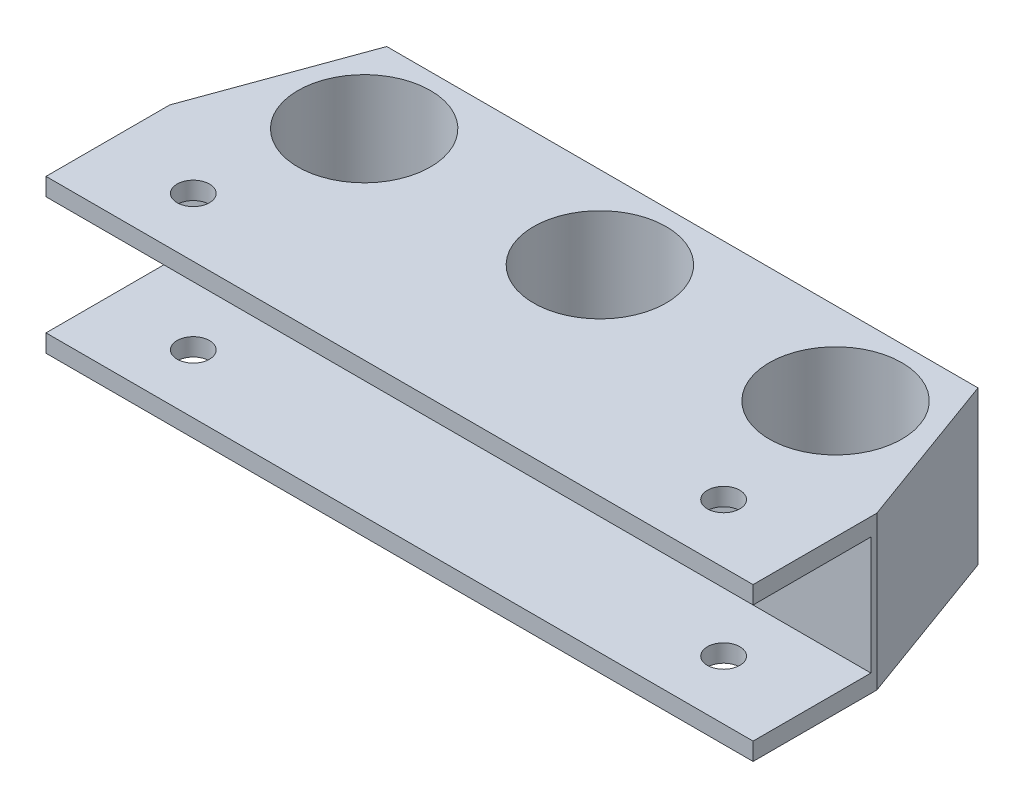
ISO-10303-21;
HEADER;
FILE_DESCRIPTION(('STEP AP214'),'2;1');
FILE_NAME('part.step','',(''),(''),'','','');
FILE_SCHEMA(('AUTOMOTIVE_DESIGN { 1 0 10303 214 1 1 1 1 }'));
ENDSEC;
DATA;
#1=APPLICATION_CONTEXT('core data for automotive mechanical design processes');
#2=APPLICATION_PROTOCOL_DEFINITION('international standard','automotive_design',2000,#1);
#3=PRODUCT_CONTEXT('',#1,'mechanical');
#4=PRODUCT('Part','Part','',(#3));
#5=PRODUCT_RELATED_PRODUCT_CATEGORY('part','',(#4));
#6=PRODUCT_DEFINITION_FORMATION('','',#4);
#7=PRODUCT_DEFINITION_CONTEXT('part definition',#1,'design');
#8=PRODUCT_DEFINITION('design','',#6,#7);
#9=PRODUCT_DEFINITION_SHAPE('','',#8);
#10=(LENGTH_UNIT() NAMED_UNIT(*) SI_UNIT(.MILLI.,.METRE.));
#11=(NAMED_UNIT(*) PLANE_ANGLE_UNIT() SI_UNIT($,.RADIAN.));
#12=(NAMED_UNIT(*) SI_UNIT($,.STERADIAN.) SOLID_ANGLE_UNIT());
#13=UNCERTAINTY_MEASURE_WITH_UNIT(LENGTH_MEASURE(1.E-05),#10,'distance_accuracy_value','');
#14=(GEOMETRIC_REPRESENTATION_CONTEXT(3) GLOBAL_UNCERTAINTY_ASSIGNED_CONTEXT((#13)) GLOBAL_UNIT_ASSIGNED_CONTEXT((#10,
#11,#12)) REPRESENTATION_CONTEXT('',''));
#15=CARTESIAN_POINT('',(0.,0.,0.));
#16=DIRECTION('',(0.,0.,1.));
#17=DIRECTION('',(1.,0.,0.));
#18=AXIS2_PLACEMENT_3D('',#15,#16,#17);
#19=CARTESIAN_POINT('',(-60.,13.,10.5));
#20=DIRECTION('',(0.,0.,-1.));
#21=DIRECTION('',(-1.,0.,0.));
#22=AXIS2_PLACEMENT_3D('',#19,#20,#21);
#23=PLANE('',#22);
#24=DIRECTION('',(0.,-1.,0.));
#25=VECTOR('',#24,1.);
#26=CARTESIAN_POINT('',(60.,13.,10.5));
#27=LINE('',#26,#25);
#28=CARTESIAN_POINT('',(60.,-9.99999999999999,10.5));
#29=VERTEX_POINT('',#28);
#30=CARTESIAN_POINT('',(60.,-13.,10.5));
#31=VERTEX_POINT('',#30);
#32=EDGE_CURVE('E162',#29,#31,#27,.T.);
#33=ORIENTED_EDGE('',*,*,#32,.F.);
#34=DIRECTION('',(-1.,0.,0.));
#35=VECTOR('',#34,1.);
#36=CARTESIAN_POINT('',(60.,-9.99999999999999,10.5));
#37=LINE('',#36,#35);
#38=CARTESIAN_POINT('',(-60.,-9.99999999999999,10.5));
#39=VERTEX_POINT('',#38);
#40=EDGE_CURVE('E206',#29,#39,#37,.T.);
#41=ORIENTED_EDGE('',*,*,#40,.T.);
#42=DIRECTION('',(0.,-1.,0.));
#43=VECTOR('',#42,1.);
#44=CARTESIAN_POINT('',(-60.,13.,10.5));
#45=LINE('',#44,#43);
#46=CARTESIAN_POINT('',(-60.,-13.,10.5));
#47=VERTEX_POINT('',#46);
#48=EDGE_CURVE('E135',#39,#47,#45,.T.);
#49=ORIENTED_EDGE('',*,*,#48,.T.);
#50=DIRECTION('',(1.,0.,0.));
#51=VECTOR('',#50,1.);
#52=CARTESIAN_POINT('',(-60.,-13.,10.5));
#53=LINE('',#52,#51);
#54=EDGE_CURVE('E156',#47,#31,#53,.T.);
#55=ORIENTED_EDGE('',*,*,#54,.T.);
#56=EDGE_LOOP('',(#33,#41,#49,#55));
#57=FACE_BOUND('',#56,.T.);
#58=ADVANCED_FACE('F40',(#57),#23,.F.);
#59=CARTESIAN_POINT('',(0.,13.,0.));
#60=DIRECTION('',(0.,1.,0.));
#61=DIRECTION('',(0.,0.,1.));
#62=AXIS2_PLACEMENT_3D('',#59,#60,#61);
#63=PLANE('',#62);
#64=CARTESIAN_POINT('',(45.,13.,0.499999999999988));
#65=DIRECTION('',(0.,-1.,0.));
#66=DIRECTION('',(0.,0.,-1.));
#67=AXIS2_PLACEMENT_3D('',#64,#65,#66);
#68=CIRCLE('',#67,2.75);
#69=CARTESIAN_POINT('',(45.,13.,-2.25000000000001));
#70=VERTEX_POINT('',#69);
#71=EDGE_CURVE('E169',#70,#70,#68,.T.);
#72=ORIENTED_EDGE('',*,*,#71,.T.);
#73=EDGE_LOOP('',(#72));
#74=FACE_BOUND('',#73,.T.);
#75=CARTESIAN_POINT('',(-45.,13.,0.499999999999988));
#76=DIRECTION('',(0.,-1.,0.));
#77=DIRECTION('',(0.,0.,-1.));
#78=AXIS2_PLACEMENT_3D('',#75,#76,#77);
#79=CIRCLE('',#78,2.75);
#80=CARTESIAN_POINT('',(-45.,13.,-2.25000000000001));
#81=VERTEX_POINT('',#80);
#82=EDGE_CURVE('E183',#81,#81,#79,.T.);
#83=ORIENTED_EDGE('',*,*,#82,.T.);
#84=EDGE_LOOP('',(#83));
#85=FACE_BOUND('',#84,.T.);
#86=CARTESIAN_POINT('',(-40.,13.,-23.4999999999997));
#87=DIRECTION('',(0.,1.,0.));
#88=DIRECTION('',(0.,0.,1.));
#89=AXIS2_PLACEMENT_3D('',#86,#87,#88);
#90=CIRCLE('',#89,11.25);
#91=CARTESIAN_POINT('',(-40.,13.,-34.7499999999997));
#92=VERTEX_POINT('',#91);
#93=EDGE_CURVE('E223',#92,#92,#90,.T.);
#94=ORIENTED_EDGE('',*,*,#93,.F.);
#95=EDGE_LOOP('',(#94));
#96=FACE_BOUND('',#95,.T.);
#97=DIRECTION('',(-0.342020143325667,0.,-0.939692620785909));
#98=VECTOR('',#97,1.);
#99=CARTESIAN_POINT('',(60.,13.,-10.5));
#100=LINE('',#99,#98);
#101=CARTESIAN_POINT('',(60.,13.,-10.5));
#102=VERTEX_POINT('',#101);
#103=CARTESIAN_POINT('',(50.1728036748127,13.,-37.4999999999997));
#104=VERTEX_POINT('',#103);
#105=EDGE_CURVE('E160',#102,#104,#100,.T.);
#106=ORIENTED_EDGE('',*,*,#105,.T.);
#107=DIRECTION('',(-1.,0.,0.));
#108=VECTOR('',#107,1.);
#109=CARTESIAN_POINT('',(50.1728036748127,13.,-37.4999999999997));
#110=LINE('',#109,#108);
#111=CARTESIAN_POINT('',(-50.1728036748127,13.,-37.4999999999997));
#112=VERTEX_POINT('',#111);
#113=EDGE_CURVE('E100',#104,#112,#110,.T.);
#114=ORIENTED_EDGE('',*,*,#113,.T.);
#115=DIRECTION('',(-0.342020143325667,0.,0.939692620785909));
#116=VECTOR('',#115,1.);
#117=CARTESIAN_POINT('',(-60.,13.,-10.5));
#118=LINE('',#117,#116);
#119=CARTESIAN_POINT('',(-60.,13.,-10.5));
#120=VERTEX_POINT('',#119);
#121=EDGE_CURVE('E118',#112,#120,#118,.T.);
#122=ORIENTED_EDGE('',*,*,#121,.T.);
#123=DIRECTION('',(0.,0.,1.));
#124=VECTOR('',#123,1.);
#125=CARTESIAN_POINT('',(-60.,13.,10.5));
#126=LINE('',#125,#124);
#127=CARTESIAN_POINT('',(-60.,13.,10.5));
#128=VERTEX_POINT('',#127);
#129=EDGE_CURVE('E110',#120,#128,#126,.T.);
#130=ORIENTED_EDGE('',*,*,#129,.T.);
#131=DIRECTION('',(1.,0.,0.));
#132=VECTOR('',#131,1.);
#133=CARTESIAN_POINT('',(-60.,13.,10.5));
#134=LINE('',#133,#132);
#135=CARTESIAN_POINT('',(60.,13.,10.5));
#136=VERTEX_POINT('',#135);
#137=EDGE_CURVE('E115',#128,#136,#134,.T.);
#138=ORIENTED_EDGE('',*,*,#137,.T.);
#139=DIRECTION('',(0.,0.,-1.));
#140=VECTOR('',#139,1.);
#141=CARTESIAN_POINT('',(60.,13.,10.5));
#142=LINE('',#141,#140);
#143=EDGE_CURVE('E66',#136,#102,#142,.T.);
#144=ORIENTED_EDGE('',*,*,#143,.T.);
#145=EDGE_LOOP('',(#106,#114,#122,#130,#138,#144));
#146=FACE_BOUND('',#145,.T.);
#147=CARTESIAN_POINT('',(0.,13.,-23.5));
#148=DIRECTION('',(0.,1.,0.));
#149=DIRECTION('',(0.,0.,1.));
#150=AXIS2_PLACEMENT_3D('',#147,#148,#149);
#151=CIRCLE('',#150,11.25);
#152=CARTESIAN_POINT('',(0.,13.,-34.75));
#153=VERTEX_POINT('',#152);
#154=EDGE_CURVE('E149',#153,#153,#151,.T.);
#155=ORIENTED_EDGE('',*,*,#154,.F.);
#156=EDGE_LOOP('',(#155));
#157=FACE_BOUND('',#156,.T.);
#158=CARTESIAN_POINT('',(40.,13.,-23.4999999999997));
#159=DIRECTION('',(0.,1.,0.));
#160=DIRECTION('',(0.,0.,-1.));
#161=AXIS2_PLACEMENT_3D('',#158,#159,#160);
#162=CIRCLE('',#161,11.25);
#163=CARTESIAN_POINT('',(40.,13.,-34.7499999999997));
#164=VERTEX_POINT('',#163);
#165=EDGE_CURVE('E217',#164,#164,#162,.T.);
#166=ORIENTED_EDGE('',*,*,#165,.F.);
#167=EDGE_LOOP('',(#166));
#168=FACE_BOUND('',#167,.T.);
#169=ADVANCED_FACE('F112',(#74,#85,#96,#146,#157,#168),#63,.T.);
#170=CARTESIAN_POINT('',(0.,-13.,0.));
#171=DIRECTION('',(0.,1.,0.));
#172=DIRECTION('',(0.,0.,1.));
#173=AXIS2_PLACEMENT_3D('',#170,#171,#172);
#174=PLANE('',#173);
#175=CARTESIAN_POINT('',(45.,-13.,0.499999999999988));
#176=DIRECTION('',(0.,-1.,0.));
#177=DIRECTION('',(0.,0.,-1.));
#178=AXIS2_PLACEMENT_3D('',#175,#176,#177);
#179=CIRCLE('',#178,2.75);
#180=CARTESIAN_POINT('',(45.,-13.,-2.25000000000001));
#181=VERTEX_POINT('',#180);
#182=EDGE_CURVE('E175',#181,#181,#179,.T.);
#183=ORIENTED_EDGE('',*,*,#182,.F.);
#184=EDGE_LOOP('',(#183));
#185=FACE_BOUND('',#184,.T.);
#186=CARTESIAN_POINT('',(-45.,-13.,0.499999999999988));
#187=DIRECTION('',(0.,-1.,0.));
#188=DIRECTION('',(0.,0.,-1.));
#189=AXIS2_PLACEMENT_3D('',#186,#187,#188);
#190=CIRCLE('',#189,2.75);
#191=CARTESIAN_POINT('',(-45.,-13.,-2.25000000000001));
#192=VERTEX_POINT('',#191);
#193=EDGE_CURVE('E180',#192,#192,#190,.T.);
#194=ORIENTED_EDGE('',*,*,#193,.F.);
#195=EDGE_LOOP('',(#194));
#196=FACE_BOUND('',#195,.T.);
#197=DIRECTION('',(-0.342020143325667,0.,-0.939692620785909));
#198=VECTOR('',#197,1.);
#199=CARTESIAN_POINT('',(60.,-13.,-10.5));
#200=LINE('',#199,#198);
#201=CARTESIAN_POINT('',(60.,-13.,-10.5));
#202=VERTEX_POINT('',#201);
#203=CARTESIAN_POINT('',(50.1728036748127,-13.,-37.4999999999997));
#204=VERTEX_POINT('',#203);
#205=EDGE_CURVE('E145',#202,#204,#200,.T.);
#206=ORIENTED_EDGE('',*,*,#205,.F.);
#207=DIRECTION('',(0.,0.,-1.));
#208=VECTOR('',#207,1.);
#209=CARTESIAN_POINT('',(60.,-13.,10.5));
#210=LINE('',#209,#208);
#211=EDGE_CURVE('E92',#31,#202,#210,.T.);
#212=ORIENTED_EDGE('',*,*,#211,.F.);
#213=ORIENTED_EDGE('',*,*,#54,.F.);
#214=DIRECTION('',(0.,0.,1.));
#215=VECTOR('',#214,1.);
#216=CARTESIAN_POINT('',(-60.,-13.,10.5));
#217=LINE('',#216,#215);
#218=CARTESIAN_POINT('',(-60.,-13.,-10.5));
#219=VERTEX_POINT('',#218);
#220=EDGE_CURVE('E153',#219,#47,#217,.T.);
#221=ORIENTED_EDGE('',*,*,#220,.F.);
#222=DIRECTION('',(-0.342020143325667,0.,0.939692620785909));
#223=VECTOR('',#222,1.);
#224=CARTESIAN_POINT('',(-60.,-13.,-10.5));
#225=LINE('',#224,#223);
#226=CARTESIAN_POINT('',(-50.1728036748127,-13.,-37.4999999999997));
#227=VERTEX_POINT('',#226);
#228=EDGE_CURVE('E151',#227,#219,#225,.T.);
#229=ORIENTED_EDGE('',*,*,#228,.F.);
#230=DIRECTION('',(-1.,0.,0.));
#231=VECTOR('',#230,1.);
#232=CARTESIAN_POINT('',(-50.1728036748127,-13.,-37.4999999999997));
#233=LINE('',#232,#231);
#234=EDGE_CURVE('E148',#204,#227,#233,.T.);
#235=ORIENTED_EDGE('',*,*,#234,.F.);
#236=EDGE_LOOP('',(#206,#212,#213,#221,#229,#235));
#237=FACE_BOUND('',#236,.T.);
#238=CARTESIAN_POINT('',(0.,-13.,-23.5));
#239=DIRECTION('',(0.,1.,0.));
#240=DIRECTION('',(0.,0.,1.));
#241=AXIS2_PLACEMENT_3D('',#238,#239,#240);
#242=CIRCLE('',#241,11.25);
#243=CARTESIAN_POINT('',(0.,-13.,-34.75));
#244=VERTEX_POINT('',#243);
#245=EDGE_CURVE('E226',#244,#244,#242,.T.);
#246=ORIENTED_EDGE('',*,*,#245,.T.);
#247=EDGE_LOOP('',(#246));
#248=FACE_BOUND('',#247,.T.);
#249=CARTESIAN_POINT('',(-40.,-13.,-23.4999999999997));
#250=DIRECTION('',(0.,1.,0.));
#251=DIRECTION('',(0.,0.,1.));
#252=AXIS2_PLACEMENT_3D('',#249,#250,#251);
#253=CIRCLE('',#252,11.25);
#254=CARTESIAN_POINT('',(-40.,-13.,-34.7499999999997));
#255=VERTEX_POINT('',#254);
#256=EDGE_CURVE('E220',#255,#255,#253,.T.);
#257=ORIENTED_EDGE('',*,*,#256,.T.);
#258=EDGE_LOOP('',(#257));
#259=FACE_BOUND('',#258,.T.);
#260=CARTESIAN_POINT('',(40.,-13.,-23.4999999999997));
#261=DIRECTION('',(0.,1.,0.));
#262=DIRECTION('',(0.,0.,-1.));
#263=AXIS2_PLACEMENT_3D('',#260,#261,#262);
#264=CIRCLE('',#263,11.25);
#265=CARTESIAN_POINT('',(40.,-13.,-34.7499999999997));
#266=VERTEX_POINT('',#265);
#267=EDGE_CURVE('E209',#266,#266,#264,.T.);
#268=ORIENTED_EDGE('',*,*,#267,.T.);
#269=EDGE_LOOP('',(#268));
#270=FACE_BOUND('',#269,.T.);
#271=ADVANCED_FACE('F244',(#185,#196,#237,#248,#259,#270),#174,.F.);
#272=CARTESIAN_POINT('',(60.,13.,-10.5));
#273=DIRECTION('',(-0.939692620785909,0.,0.342020143325667));
#274=DIRECTION('',(0.342020143325667,0.,0.939692620785909));
#275=AXIS2_PLACEMENT_3D('',#272,#273,#274);
#276=PLANE('',#275);
#277=ORIENTED_EDGE('',*,*,#205,.T.);
#278=DIRECTION('',(0.,-1.,0.));
#279=VECTOR('',#278,1.);
#280=CARTESIAN_POINT('',(50.1728036748127,13.,-37.4999999999997));
#281=LINE('',#280,#279);
#282=EDGE_CURVE('E11',#104,#204,#281,.T.);
#283=ORIENTED_EDGE('',*,*,#282,.F.);
#284=ORIENTED_EDGE('',*,*,#105,.F.);
#285=DIRECTION('',(0.,-1.,0.));
#286=VECTOR('',#285,1.);
#287=CARTESIAN_POINT('',(60.,13.,-10.5));
#288=LINE('',#287,#286);
#289=EDGE_CURVE('E141',#102,#202,#288,.T.);
#290=ORIENTED_EDGE('',*,*,#289,.T.);
#291=EDGE_LOOP('',(#277,#283,#284,#290));
#292=FACE_BOUND('',#291,.T.);
#293=ADVANCED_FACE('F42',(#292),#276,.F.);
#294=CARTESIAN_POINT('',(-50.1728036748127,13.,-37.4999999999997));
#295=DIRECTION('',(0.,0.,1.));
#296=DIRECTION('',(1.,0.,0.));
#297=AXIS2_PLACEMENT_3D('',#294,#295,#296);
#298=PLANE('',#297);
#299=ORIENTED_EDGE('',*,*,#234,.T.);
#300=DIRECTION('',(0.,-1.,0.));
#301=VECTOR('',#300,1.);
#302=CARTESIAN_POINT('',(-50.1728036748127,13.,-37.4999999999997));
#303=LINE('',#302,#301);
#304=EDGE_CURVE('E49',#112,#227,#303,.T.);
#305=ORIENTED_EDGE('',*,*,#304,.F.);
#306=ORIENTED_EDGE('',*,*,#113,.F.);
#307=ORIENTED_EDGE('',*,*,#282,.T.);
#308=EDGE_LOOP('',(#299,#305,#306,#307));
#309=FACE_BOUND('',#308,.T.);
#310=ADVANCED_FACE('F236',(#309),#298,.F.);
#311=CARTESIAN_POINT('',(-60.,13.,-10.5));
#312=DIRECTION('',(0.939692620785909,0.,0.342020143325667));
#313=DIRECTION('',(0.342020143325667,0.,-0.939692620785909));
#314=AXIS2_PLACEMENT_3D('',#311,#312,#313);
#315=PLANE('',#314);
#316=ORIENTED_EDGE('',*,*,#228,.T.);
#317=DIRECTION('',(0.,-1.,0.));
#318=VECTOR('',#317,1.);
#319=CARTESIAN_POINT('',(-60.,13.,-10.5));
#320=LINE('',#319,#318);
#321=EDGE_CURVE('E134',#120,#219,#320,.T.);
#322=ORIENTED_EDGE('',*,*,#321,.F.);
#323=ORIENTED_EDGE('',*,*,#121,.F.);
#324=ORIENTED_EDGE('',*,*,#304,.T.);
#325=EDGE_LOOP('',(#316,#322,#323,#324));
#326=FACE_BOUND('',#325,.T.);
#327=ADVANCED_FACE('F239',(#326),#315,.F.);
#328=CARTESIAN_POINT('',(-60.,13.,10.5));
#329=DIRECTION('',(1.,0.,0.));
#330=DIRECTION('',(0.,0.,-1.));
#331=AXIS2_PLACEMENT_3D('',#328,#329,#330);
#332=PLANE('',#331);
#333=ORIENTED_EDGE('',*,*,#48,.F.);
#334=DIRECTION('',(0.,0.,1.));
#335=VECTOR('',#334,1.);
#336=CARTESIAN_POINT('',(-60.,-9.99999999999999,-9.5));
#337=LINE('',#336,#335);
#338=CARTESIAN_POINT('',(-60.,-9.99999999999999,-9.5));
#339=VERTEX_POINT('',#338);
#340=EDGE_CURVE('E194',#339,#39,#337,.T.);
#341=ORIENTED_EDGE('',*,*,#340,.F.);
#342=DIRECTION('',(0.,-1.,0.));
#343=VECTOR('',#342,1.);
#344=CARTESIAN_POINT('',(-60.,9.99999999999999,-9.50000000000001));
#345=LINE('',#344,#343);
#346=CARTESIAN_POINT('',(-60.,9.99999999999999,-9.50000000000001));
#347=VERTEX_POINT('',#346);
#348=EDGE_CURVE('E201',#347,#339,#345,.T.);
#349=ORIENTED_EDGE('',*,*,#348,.F.);
#350=DIRECTION('',(0.,0.,-1.));
#351=VECTOR('',#350,1.);
#352=CARTESIAN_POINT('',(-60.,9.99999999999999,-9.50000000000001));
#353=LINE('',#352,#351);
#354=CARTESIAN_POINT('',(-60.,9.99999999999999,10.5));
#355=VERTEX_POINT('',#354);
#356=EDGE_CURVE('E131',#355,#347,#353,.T.);
#357=ORIENTED_EDGE('',*,*,#356,.F.);
#358=EDGE_CURVE('E125',#128,#355,#45,.T.);
#359=ORIENTED_EDGE('',*,*,#358,.F.);
#360=ORIENTED_EDGE('',*,*,#129,.F.);
#361=ORIENTED_EDGE('',*,*,#321,.T.);
#362=ORIENTED_EDGE('',*,*,#220,.T.);
#363=EDGE_LOOP('',(#333,#341,#349,#357,#359,#360,#361,#362));
#364=FACE_BOUND('',#363,.T.);
#365=ADVANCED_FACE('F127',(#364),#332,.F.);
#366=ORIENTED_EDGE('',*,*,#358,.T.);
#367=DIRECTION('',(-1.,0.,0.));
#368=VECTOR('',#367,1.);
#369=CARTESIAN_POINT('',(60.,9.99999999999999,10.5));
#370=LINE('',#369,#368);
#371=CARTESIAN_POINT('',(60.,9.99999999999999,10.5));
#372=VERTEX_POINT('',#371);
#373=EDGE_CURVE('E199',#372,#355,#370,.T.);
#374=ORIENTED_EDGE('',*,*,#373,.F.);
#375=EDGE_CURVE('E139',#136,#372,#27,.T.);
#376=ORIENTED_EDGE('',*,*,#375,.F.);
#377=ORIENTED_EDGE('',*,*,#137,.F.);
#378=EDGE_LOOP('',(#366,#374,#376,#377));
#379=FACE_BOUND('',#378,.T.);
#380=ADVANCED_FACE('F137',(#379),#23,.F.);
#381=CARTESIAN_POINT('',(60.,13.,10.5));
#382=DIRECTION('',(-1.,0.,0.));
#383=DIRECTION('',(0.,0.,1.));
#384=AXIS2_PLACEMENT_3D('',#381,#382,#383);
#385=PLANE('',#384);
#386=DIRECTION('',(0.,-1.,0.));
#387=VECTOR('',#386,1.);
#388=CARTESIAN_POINT('',(60.,9.99999999999999,-9.50000000000001));
#389=LINE('',#388,#387);
#390=CARTESIAN_POINT('',(60.,9.99999999999999,-9.50000000000001));
#391=VERTEX_POINT('',#390);
#392=CARTESIAN_POINT('',(60.,-9.99999999999999,-9.5));
#393=VERTEX_POINT('',#392);
#394=EDGE_CURVE('E57',#391,#393,#389,.T.);
#395=ORIENTED_EDGE('',*,*,#394,.T.);
#396=DIRECTION('',(0.,0.,1.));
#397=VECTOR('',#396,1.);
#398=CARTESIAN_POINT('',(60.,-9.99999999999999,-9.5));
#399=LINE('',#398,#397);
#400=EDGE_CURVE('E196',#393,#29,#399,.T.);
#401=ORIENTED_EDGE('',*,*,#400,.T.);
#402=ORIENTED_EDGE('',*,*,#32,.T.);
#403=ORIENTED_EDGE('',*,*,#211,.T.);
#404=ORIENTED_EDGE('',*,*,#289,.F.);
#405=ORIENTED_EDGE('',*,*,#143,.F.);
#406=ORIENTED_EDGE('',*,*,#375,.T.);
#407=DIRECTION('',(0.,0.,-1.));
#408=VECTOR('',#407,1.);
#409=CARTESIAN_POINT('',(60.,9.99999999999999,-9.50000000000001));
#410=LINE('',#409,#408);
#411=EDGE_CURVE('E191',#372,#391,#410,.T.);
#412=ORIENTED_EDGE('',*,*,#411,.T.);
#413=EDGE_LOOP('',(#395,#401,#402,#403,#404,#405,#406,#412));
#414=FACE_BOUND('',#413,.T.);
#415=ADVANCED_FACE('F264',(#414),#385,.F.);
#416=CARTESIAN_POINT('',(0.,13.,-23.5));
#417=DIRECTION('',(0.,-1.,0.));
#418=DIRECTION('',(0.,0.,-1.));
#419=AXIS2_PLACEMENT_3D('',#416,#417,#418);
#420=CYLINDRICAL_SURFACE('',#419,11.25);
#421=CARTESIAN_POINT('',(0.,13.,-34.75));
#422=CARTESIAN_POINT('',(0.,12.7291666666667,-34.75));
#423=CARTESIAN_POINT('',(0.,12.4583333333333,-34.75));
#424=CARTESIAN_POINT('',(0.,11.9166666666667,-34.75));
#425=CARTESIAN_POINT('',(0.,11.6458333333333,-34.75));
#426=CARTESIAN_POINT('',(0.,11.1041666666667,-34.75));
#427=CARTESIAN_POINT('',(0.,10.8333333333333,-34.75));
#428=CARTESIAN_POINT('',(0.,10.2916666666667,-34.75));
#429=CARTESIAN_POINT('',(0.,10.0208333333333,-34.75));
#430=CARTESIAN_POINT('',(0.,9.47916666666667,-34.75));
#431=CARTESIAN_POINT('',(0.,9.20833333333333,-34.75));
#432=CARTESIAN_POINT('',(0.,8.66666666666667,-34.75));
#433=CARTESIAN_POINT('',(0.,8.39583333333333,-34.75));
#434=CARTESIAN_POINT('',(0.,7.85416666666667,-34.75));
#435=CARTESIAN_POINT('',(0.,7.58333333333333,-34.75));
#436=CARTESIAN_POINT('',(0.,7.04166666666667,-34.75));
#437=CARTESIAN_POINT('',(0.,6.77083333333333,-34.75));
#438=CARTESIAN_POINT('',(0.,6.22916666666667,-34.75));
#439=CARTESIAN_POINT('',(0.,5.95833333333333,-34.75));
#440=CARTESIAN_POINT('',(0.,5.41666666666667,-34.75));
#441=CARTESIAN_POINT('',(0.,5.14583333333333,-34.75));
#442=CARTESIAN_POINT('',(0.,4.60416666666667,-34.75));
#443=CARTESIAN_POINT('',(0.,4.33333333333333,-34.75));
#444=CARTESIAN_POINT('',(0.,3.79166666666667,-34.75));
#445=CARTESIAN_POINT('',(0.,3.52083333333333,-34.75));
#446=CARTESIAN_POINT('',(0.,2.97916666666666,-34.75));
#447=CARTESIAN_POINT('',(0.,2.70833333333333,-34.75));
#448=CARTESIAN_POINT('',(0.,2.16666666666667,-34.75));
#449=CARTESIAN_POINT('',(0.,1.89583333333333,-34.75));
#450=CARTESIAN_POINT('',(0.,1.35416666666666,-34.75));
#451=CARTESIAN_POINT('',(0.,1.08333333333333,-34.75));
#452=CARTESIAN_POINT('',(0.,0.541666666666665,-34.75));
#453=CARTESIAN_POINT('',(0.,0.270833333333332,-34.75));
#454=CARTESIAN_POINT('',(0.,-0.270833333333335,-34.75));
#455=CARTESIAN_POINT('',(0.,-0.541666666666669,-34.75));
#456=CARTESIAN_POINT('',(0.,-1.08333333333334,-34.75));
#457=CARTESIAN_POINT('',(0.,-1.35416666666667,-34.75));
#458=CARTESIAN_POINT('',(0.,-1.89583333333333,-34.75));
#459=CARTESIAN_POINT('',(0.,-2.16666666666667,-34.75));
#460=CARTESIAN_POINT('',(0.,-2.70833333333333,-34.75));
#461=CARTESIAN_POINT('',(0.,-2.97916666666667,-34.75));
#462=CARTESIAN_POINT('',(0.,-3.52083333333333,-34.75));
#463=CARTESIAN_POINT('',(0.,-3.79166666666667,-34.75));
#464=CARTESIAN_POINT('',(0.,-4.33333333333333,-34.75));
#465=CARTESIAN_POINT('',(0.,-4.60416666666667,-34.75));
#466=CARTESIAN_POINT('',(0.,-5.14583333333333,-34.75));
#467=CARTESIAN_POINT('',(0.,-5.41666666666667,-34.75));
#468=CARTESIAN_POINT('',(0.,-5.95833333333333,-34.75));
#469=CARTESIAN_POINT('',(0.,-6.22916666666667,-34.75));
#470=CARTESIAN_POINT('',(0.,-6.77083333333333,-34.75));
#471=CARTESIAN_POINT('',(0.,-7.04166666666667,-34.75));
#472=CARTESIAN_POINT('',(0.,-7.58333333333333,-34.75));
#473=CARTESIAN_POINT('',(0.,-7.85416666666667,-34.75));
#474=CARTESIAN_POINT('',(0.,-8.39583333333333,-34.75));
#475=CARTESIAN_POINT('',(0.,-8.66666666666667,-34.75));
#476=CARTESIAN_POINT('',(0.,-9.20833333333333,-34.75));
#477=CARTESIAN_POINT('',(0.,-9.47916666666667,-34.75));
#478=CARTESIAN_POINT('',(0.,-10.0208333333333,-34.75));
#479=CARTESIAN_POINT('',(0.,-10.2916666666667,-34.75));
#480=CARTESIAN_POINT('',(0.,-10.8333333333333,-34.75));
#481=CARTESIAN_POINT('',(0.,-11.1041666666667,-34.75));
#482=CARTESIAN_POINT('',(0.,-11.6458333333333,-34.75));
#483=CARTESIAN_POINT('',(0.,-11.9166666666667,-34.75));
#484=CARTESIAN_POINT('',(0.,-12.4583333333333,-34.75));
#485=CARTESIAN_POINT('',(0.,-12.7291666666667,-34.75));
#486=CARTESIAN_POINT('',(0.,-13.,-34.75));
#487=B_SPLINE_CURVE_WITH_KNOTS('',3,(#421,#422,#423,#424,#425,#426,#427,#428,#429,#430,#431,
#432,#433,#434,#435,#436,#437,#438,#439,#440,#441,#442,#443,#444,#445,#446,#447,#448,#449,#450,
#451,#452,#453,#454,#455,#456,#457,#458,#459,#460,#461,#462,#463,#464,#465,#466,#467,#468,#469,
#470,#471,#472,#473,#474,#475,#476,#477,#478,#479,#480,#481,#482,#483,#484,#485,#486),
.UNSPECIFIED.,.F.,.F.,(4,2,2,2,2,2,2,2,2,2,2,2,2,2,2,2,2,2,2,2,2,2,2,2,2,2,2,2,2,2,2,2,4),(0.,
0.812499999999999,1.625,2.4375,3.25,4.0625,4.875,5.6875,6.5,7.3125,8.125,8.9375,9.75,10.5625,
11.375,12.1875,13.,13.8125,14.625,15.4375,16.25,17.0625,17.875,18.6875,19.5,20.3125,21.125,
21.9375,22.75,23.5625,24.375,25.1875,26.),.UNSPECIFIED.);
#488=EDGE_CURVE('BSEAM295',#153,#244,#487,.T.);
#489=ORIENTED_EDGE('',*,*,#154,.T.);
#490=ORIENTED_EDGE('',*,*,#245,.F.);
#491=ORIENTED_EDGE('',*,*,#488,.T.);
#492=ORIENTED_EDGE('',*,*,#488,.F.);
#493=EDGE_LOOP('',(#489,#491,#490,#492));
#494=FACE_BOUND('',#493,.T.);
#495=ADVANCED_FACE('F295',(#494),#420,.F.);
#496=CARTESIAN_POINT('',(-40.,13.,-23.4999999999997));
#497=DIRECTION('',(0.,-1.,0.));
#498=DIRECTION('',(0.,0.,-1.));
#499=AXIS2_PLACEMENT_3D('',#496,#497,#498);
#500=CYLINDRICAL_SURFACE('',#499,11.25);
#501=CARTESIAN_POINT('',(-40.,13.,-34.7499999999997));
#502=CARTESIAN_POINT('',(-40.,12.7291666666667,-34.7499999999997));
#503=CARTESIAN_POINT('',(-40.,12.4583333333333,-34.7499999999997));
#504=CARTESIAN_POINT('',(-40.,11.9166666666667,-34.7499999999997));
#505=CARTESIAN_POINT('',(-40.,11.6458333333333,-34.7499999999997));
#506=CARTESIAN_POINT('',(-40.,11.1041666666667,-34.7499999999997));
#507=CARTESIAN_POINT('',(-40.,10.8333333333333,-34.7499999999997));
#508=CARTESIAN_POINT('',(-40.,10.2916666666667,-34.7499999999997));
#509=CARTESIAN_POINT('',(-40.,10.0208333333333,-34.7499999999997));
#510=CARTESIAN_POINT('',(-40.,9.47916666666667,-34.7499999999997));
#511=CARTESIAN_POINT('',(-40.,9.20833333333333,-34.7499999999997));
#512=CARTESIAN_POINT('',(-40.,8.66666666666667,-34.7499999999997));
#513=CARTESIAN_POINT('',(-40.,8.39583333333333,-34.7499999999997));
#514=CARTESIAN_POINT('',(-40.,7.85416666666667,-34.7499999999997));
#515=CARTESIAN_POINT('',(-40.,7.58333333333333,-34.7499999999997));
#516=CARTESIAN_POINT('',(-40.,7.04166666666667,-34.7499999999997));
#517=CARTESIAN_POINT('',(-40.,6.77083333333333,-34.7499999999997));
#518=CARTESIAN_POINT('',(-40.,6.22916666666667,-34.7499999999997));
#519=CARTESIAN_POINT('',(-40.,5.95833333333333,-34.7499999999997));
#520=CARTESIAN_POINT('',(-40.,5.41666666666667,-34.7499999999997));
#521=CARTESIAN_POINT('',(-40.,5.14583333333333,-34.7499999999997));
#522=CARTESIAN_POINT('',(-40.,4.60416666666667,-34.7499999999997));
#523=CARTESIAN_POINT('',(-40.,4.33333333333333,-34.7499999999997));
#524=CARTESIAN_POINT('',(-40.,3.79166666666667,-34.7499999999997));
#525=CARTESIAN_POINT('',(-40.,3.52083333333333,-34.7499999999997));
#526=CARTESIAN_POINT('',(-40.,2.97916666666666,-34.7499999999997));
#527=CARTESIAN_POINT('',(-40.,2.70833333333333,-34.7499999999997));
#528=CARTESIAN_POINT('',(-40.,2.16666666666667,-34.7499999999997));
#529=CARTESIAN_POINT('',(-40.,1.89583333333333,-34.7499999999997));
#530=CARTESIAN_POINT('',(-40.,1.35416666666666,-34.7499999999997));
#531=CARTESIAN_POINT('',(-40.,1.08333333333333,-34.7499999999997));
#532=CARTESIAN_POINT('',(-40.,0.541666666666665,-34.7499999999997));
#533=CARTESIAN_POINT('',(-40.,0.270833333333332,-34.7499999999997));
#534=CARTESIAN_POINT('',(-40.,-0.270833333333335,-34.7499999999997));
#535=CARTESIAN_POINT('',(-40.,-0.541666666666669,-34.7499999999997));
#536=CARTESIAN_POINT('',(-40.,-1.08333333333334,-34.7499999999997));
#537=CARTESIAN_POINT('',(-40.,-1.35416666666667,-34.7499999999997));
#538=CARTESIAN_POINT('',(-40.,-1.89583333333333,-34.7499999999997));
#539=CARTESIAN_POINT('',(-40.,-2.16666666666667,-34.7499999999997));
#540=CARTESIAN_POINT('',(-40.,-2.70833333333333,-34.7499999999997));
#541=CARTESIAN_POINT('',(-40.,-2.97916666666667,-34.7499999999997));
#542=CARTESIAN_POINT('',(-40.,-3.52083333333333,-34.7499999999997));
#543=CARTESIAN_POINT('',(-40.,-3.79166666666667,-34.7499999999997));
#544=CARTESIAN_POINT('',(-40.,-4.33333333333333,-34.7499999999997));
#545=CARTESIAN_POINT('',(-40.,-4.60416666666667,-34.7499999999997));
#546=CARTESIAN_POINT('',(-40.,-5.14583333333333,-34.7499999999997));
#547=CARTESIAN_POINT('',(-40.,-5.41666666666667,-34.7499999999997));
#548=CARTESIAN_POINT('',(-40.,-5.95833333333333,-34.7499999999997));
#549=CARTESIAN_POINT('',(-40.,-6.22916666666667,-34.7499999999997));
#550=CARTESIAN_POINT('',(-40.,-6.77083333333333,-34.7499999999997));
#551=CARTESIAN_POINT('',(-40.,-7.04166666666667,-34.7499999999997));
#552=CARTESIAN_POINT('',(-40.,-7.58333333333333,-34.7499999999997));
#553=CARTESIAN_POINT('',(-40.,-7.85416666666667,-34.7499999999997));
#554=CARTESIAN_POINT('',(-40.,-8.39583333333333,-34.7499999999997));
#555=CARTESIAN_POINT('',(-40.,-8.66666666666667,-34.7499999999997));
#556=CARTESIAN_POINT('',(-40.,-9.20833333333333,-34.7499999999997));
#557=CARTESIAN_POINT('',(-40.,-9.47916666666667,-34.7499999999997));
#558=CARTESIAN_POINT('',(-40.,-10.0208333333333,-34.7499999999997));
#559=CARTESIAN_POINT('',(-40.,-10.2916666666667,-34.7499999999997));
#560=CARTESIAN_POINT('',(-40.,-10.8333333333333,-34.7499999999997));
#561=CARTESIAN_POINT('',(-40.,-11.1041666666667,-34.7499999999997));
#562=CARTESIAN_POINT('',(-40.,-11.6458333333333,-34.7499999999997));
#563=CARTESIAN_POINT('',(-40.,-11.9166666666667,-34.7499999999997));
#564=CARTESIAN_POINT('',(-40.,-12.4583333333333,-34.7499999999997));
#565=CARTESIAN_POINT('',(-40.,-12.7291666666667,-34.7499999999997));
#566=CARTESIAN_POINT('',(-40.,-13.,-34.7499999999997));
#567=B_SPLINE_CURVE_WITH_KNOTS('',3,(#501,#502,#503,#504,#505,#506,#507,#508,#509,#510,#511,
#512,#513,#514,#515,#516,#517,#518,#519,#520,#521,#522,#523,#524,#525,#526,#527,#528,#529,#530,
#531,#532,#533,#534,#535,#536,#537,#538,#539,#540,#541,#542,#543,#544,#545,#546,#547,#548,#549,
#550,#551,#552,#553,#554,#555,#556,#557,#558,#559,#560,#561,#562,#563,#564,#565,#566),
.UNSPECIFIED.,.F.,.F.,(4,2,2,2,2,2,2,2,2,2,2,2,2,2,2,2,2,2,2,2,2,2,2,2,2,2,2,2,2,2,2,2,4),(0.,
0.812499999999999,1.625,2.4375,3.25,4.0625,4.875,5.6875,6.5,7.3125,8.125,8.9375,9.75,10.5625,
11.375,12.1875,13.,13.8125,14.625,15.4375,16.25,17.0625,17.875,18.6875,19.5,20.3125,21.125,
21.9375,22.75,23.5625,24.375,25.1875,26.),.UNSPECIFIED.);
#568=EDGE_CURVE('BSEAM317',#92,#255,#567,.T.);
#569=ORIENTED_EDGE('',*,*,#93,.T.);
#570=ORIENTED_EDGE('',*,*,#256,.F.);
#571=ORIENTED_EDGE('',*,*,#568,.T.);
#572=ORIENTED_EDGE('',*,*,#568,.F.);
#573=EDGE_LOOP('',(#569,#571,#570,#572));
#574=FACE_BOUND('',#573,.T.);
#575=ADVANCED_FACE('F317',(#574),#500,.F.);
#576=CARTESIAN_POINT('',(40.,13.,-23.4999999999997));
#577=DIRECTION('',(0.,-1.,0.));
#578=DIRECTION('',(0.,0.,-1.));
#579=AXIS2_PLACEMENT_3D('',#576,#577,#578);
#580=CYLINDRICAL_SURFACE('',#579,11.25);
#581=CARTESIAN_POINT('',(40.,13.,-34.7499999999997));
#582=CARTESIAN_POINT('',(40.,12.7291666666667,-34.7499999999997));
#583=CARTESIAN_POINT('',(40.,12.4583333333333,-34.7499999999997));
#584=CARTESIAN_POINT('',(40.,11.9166666666667,-34.7499999999997));
#585=CARTESIAN_POINT('',(40.,11.6458333333333,-34.7499999999997));
#586=CARTESIAN_POINT('',(40.,11.1041666666667,-34.7499999999997));
#587=CARTESIAN_POINT('',(40.,10.8333333333333,-34.7499999999997));
#588=CARTESIAN_POINT('',(40.,10.2916666666667,-34.7499999999997));
#589=CARTESIAN_POINT('',(40.,10.0208333333333,-34.7499999999997));
#590=CARTESIAN_POINT('',(40.,9.47916666666667,-34.7499999999997));
#591=CARTESIAN_POINT('',(40.,9.20833333333333,-34.7499999999997));
#592=CARTESIAN_POINT('',(40.,8.66666666666667,-34.7499999999997));
#593=CARTESIAN_POINT('',(40.,8.39583333333333,-34.7499999999997));
#594=CARTESIAN_POINT('',(40.,7.85416666666667,-34.7499999999997));
#595=CARTESIAN_POINT('',(40.,7.58333333333333,-34.7499999999997));
#596=CARTESIAN_POINT('',(40.,7.04166666666667,-34.7499999999997));
#597=CARTESIAN_POINT('',(40.,6.77083333333333,-34.7499999999997));
#598=CARTESIAN_POINT('',(40.,6.22916666666667,-34.7499999999997));
#599=CARTESIAN_POINT('',(40.,5.95833333333333,-34.7499999999997));
#600=CARTESIAN_POINT('',(40.,5.41666666666667,-34.7499999999997));
#601=CARTESIAN_POINT('',(40.,5.14583333333333,-34.7499999999997));
#602=CARTESIAN_POINT('',(40.,4.60416666666667,-34.7499999999997));
#603=CARTESIAN_POINT('',(40.,4.33333333333333,-34.7499999999997));
#604=CARTESIAN_POINT('',(40.,3.79166666666667,-34.7499999999997));
#605=CARTESIAN_POINT('',(40.,3.52083333333333,-34.7499999999997));
#606=CARTESIAN_POINT('',(40.,2.97916666666666,-34.7499999999997));
#607=CARTESIAN_POINT('',(40.,2.70833333333333,-34.7499999999997));
#608=CARTESIAN_POINT('',(40.,2.16666666666667,-34.7499999999997));
#609=CARTESIAN_POINT('',(40.,1.89583333333333,-34.7499999999997));
#610=CARTESIAN_POINT('',(40.,1.35416666666666,-34.7499999999997));
#611=CARTESIAN_POINT('',(40.,1.08333333333333,-34.7499999999997));
#612=CARTESIAN_POINT('',(40.,0.541666666666665,-34.7499999999997));
#613=CARTESIAN_POINT('',(40.,0.270833333333332,-34.7499999999997));
#614=CARTESIAN_POINT('',(40.,-0.270833333333335,-34.7499999999997));
#615=CARTESIAN_POINT('',(40.,-0.541666666666669,-34.7499999999997));
#616=CARTESIAN_POINT('',(40.,-1.08333333333334,-34.7499999999997));
#617=CARTESIAN_POINT('',(40.,-1.35416666666667,-34.7499999999997));
#618=CARTESIAN_POINT('',(40.,-1.89583333333333,-34.7499999999997));
#619=CARTESIAN_POINT('',(40.,-2.16666666666667,-34.7499999999997));
#620=CARTESIAN_POINT('',(40.,-2.70833333333333,-34.7499999999997));
#621=CARTESIAN_POINT('',(40.,-2.97916666666667,-34.7499999999997));
#622=CARTESIAN_POINT('',(40.,-3.52083333333333,-34.7499999999997));
#623=CARTESIAN_POINT('',(40.,-3.79166666666667,-34.7499999999997));
#624=CARTESIAN_POINT('',(40.,-4.33333333333333,-34.7499999999997));
#625=CARTESIAN_POINT('',(40.,-4.60416666666667,-34.7499999999997));
#626=CARTESIAN_POINT('',(40.,-5.14583333333333,-34.7499999999997));
#627=CARTESIAN_POINT('',(40.,-5.41666666666667,-34.7499999999997));
#628=CARTESIAN_POINT('',(40.,-5.95833333333333,-34.7499999999997));
#629=CARTESIAN_POINT('',(40.,-6.22916666666667,-34.7499999999997));
#630=CARTESIAN_POINT('',(40.,-6.77083333333333,-34.7499999999997));
#631=CARTESIAN_POINT('',(40.,-7.04166666666667,-34.7499999999997));
#632=CARTESIAN_POINT('',(40.,-7.58333333333333,-34.7499999999997));
#633=CARTESIAN_POINT('',(40.,-7.85416666666667,-34.7499999999997));
#634=CARTESIAN_POINT('',(40.,-8.39583333333333,-34.7499999999997));
#635=CARTESIAN_POINT('',(40.,-8.66666666666667,-34.7499999999997));
#636=CARTESIAN_POINT('',(40.,-9.20833333333333,-34.7499999999997));
#637=CARTESIAN_POINT('',(40.,-9.47916666666667,-34.7499999999997));
#638=CARTESIAN_POINT('',(40.,-10.0208333333333,-34.7499999999997));
#639=CARTESIAN_POINT('',(40.,-10.2916666666667,-34.7499999999997));
#640=CARTESIAN_POINT('',(40.,-10.8333333333333,-34.7499999999997));
#641=CARTESIAN_POINT('',(40.,-11.1041666666667,-34.7499999999997));
#642=CARTESIAN_POINT('',(40.,-11.6458333333333,-34.7499999999997));
#643=CARTESIAN_POINT('',(40.,-11.9166666666667,-34.7499999999997));
#644=CARTESIAN_POINT('',(40.,-12.4583333333333,-34.7499999999997));
#645=CARTESIAN_POINT('',(40.,-12.7291666666667,-34.7499999999997));
#646=CARTESIAN_POINT('',(40.,-13.,-34.7499999999997));
#647=B_SPLINE_CURVE_WITH_KNOTS('',3,(#581,#582,#583,#584,#585,#586,#587,#588,#589,#590,#591,
#592,#593,#594,#595,#596,#597,#598,#599,#600,#601,#602,#603,#604,#605,#606,#607,#608,#609,#610,
#611,#612,#613,#614,#615,#616,#617,#618,#619,#620,#621,#622,#623,#624,#625,#626,#627,#628,#629,
#630,#631,#632,#633,#634,#635,#636,#637,#638,#639,#640,#641,#642,#643,#644,#645,#646),
.UNSPECIFIED.,.F.,.F.,(4,2,2,2,2,2,2,2,2,2,2,2,2,2,2,2,2,2,2,2,2,2,2,2,2,2,2,2,2,2,2,2,4),(0.,
0.812499999999999,1.625,2.4375,3.25,4.0625,4.875,5.6875,6.5,7.3125,8.125,8.9375,9.75,10.5625,
11.375,12.1875,13.,13.8125,14.625,15.4375,16.25,17.0625,17.875,18.6875,19.5,20.3125,21.125,
21.9375,22.75,23.5625,24.375,25.1875,26.),.UNSPECIFIED.);
#648=EDGE_CURVE('BSEAM320',#164,#266,#647,.T.);
#649=ORIENTED_EDGE('',*,*,#165,.T.);
#650=ORIENTED_EDGE('',*,*,#267,.F.);
#651=ORIENTED_EDGE('',*,*,#648,.T.);
#652=ORIENTED_EDGE('',*,*,#648,.F.);
#653=EDGE_LOOP('',(#649,#651,#650,#652));
#654=FACE_BOUND('',#653,.T.);
#655=ADVANCED_FACE('F320',(#654),#580,.F.);
#656=CARTESIAN_POINT('',(60.,-9.99999999999999,-9.5));
#657=DIRECTION('',(0.,-1.,0.));
#658=DIRECTION('',(0.,0.,-1.));
#659=AXIS2_PLACEMENT_3D('',#656,#657,#658);
#660=PLANE('',#659);
#661=CARTESIAN_POINT('',(45.,-9.99999999999999,0.499999999999988));
#662=DIRECTION('',(0.,-1.,0.));
#663=DIRECTION('',(0.,0.,-1.));
#664=AXIS2_PLACEMENT_3D('',#661,#662,#663);
#665=CIRCLE('',#664,2.75);
#666=CARTESIAN_POINT('',(45.,-9.99999999999999,-2.25000000000001));
#667=VERTEX_POINT('',#666);
#668=EDGE_CURVE('E188',#667,#667,#665,.T.);
#669=ORIENTED_EDGE('',*,*,#668,.T.);
#670=EDGE_LOOP('',(#669));
#671=FACE_BOUND('',#670,.T.);
#672=CARTESIAN_POINT('',(-45.,-9.99999999999999,0.499999999999988));
#673=DIRECTION('',(0.,-1.,0.));
#674=DIRECTION('',(0.,0.,-1.));
#675=AXIS2_PLACEMENT_3D('',#672,#673,#674);
#676=CIRCLE('',#675,2.75);
#677=CARTESIAN_POINT('',(-45.,-9.99999999999999,-2.25000000000001));
#678=VERTEX_POINT('',#677);
#679=EDGE_CURVE('E168',#678,#678,#676,.T.);
#680=ORIENTED_EDGE('',*,*,#679,.T.);
#681=EDGE_LOOP('',(#680));
#682=FACE_BOUND('',#681,.T.);
#683=ORIENTED_EDGE('',*,*,#340,.T.);
#684=ORIENTED_EDGE('',*,*,#40,.F.);
#685=ORIENTED_EDGE('',*,*,#400,.F.);
#686=DIRECTION('',(-1.,0.,0.));
#687=VECTOR('',#686,1.);
#688=CARTESIAN_POINT('',(60.,-9.99999999999999,-9.5));
#689=LINE('',#688,#687);
#690=EDGE_CURVE('E210',#393,#339,#689,.T.);
#691=ORIENTED_EDGE('',*,*,#690,.T.);
#692=EDGE_LOOP('',(#683,#684,#685,#691));
#693=FACE_BOUND('',#692,.T.);
#694=ADVANCED_FACE('F263',(#671,#682,#693),#660,.F.);
#695=CARTESIAN_POINT('',(60.,9.99999999999999,-9.50000000000001));
#696=DIRECTION('',(0.,0.,-1.));
#697=DIRECTION('',(0.,1.,0.));
#698=AXIS2_PLACEMENT_3D('',#695,#696,#697);
#699=PLANE('',#698);
#700=ORIENTED_EDGE('',*,*,#348,.T.);
#701=ORIENTED_EDGE('',*,*,#690,.F.);
#702=ORIENTED_EDGE('',*,*,#394,.F.);
#703=DIRECTION('',(-1.,0.,0.));
#704=VECTOR('',#703,1.);
#705=CARTESIAN_POINT('',(60.,9.99999999999999,-9.50000000000001));
#706=LINE('',#705,#704);
#707=EDGE_CURVE('E213',#391,#347,#706,.T.);
#708=ORIENTED_EDGE('',*,*,#707,.T.);
#709=EDGE_LOOP('',(#700,#701,#702,#708));
#710=FACE_BOUND('',#709,.T.);
#711=ADVANCED_FACE('F262',(#710),#699,.F.);
#712=CARTESIAN_POINT('',(60.,9.99999999999999,-9.50000000000001));
#713=DIRECTION('',(0.,1.,0.));
#714=DIRECTION('',(0.,0.,1.));
#715=AXIS2_PLACEMENT_3D('',#712,#713,#714);
#716=PLANE('',#715);
#717=CARTESIAN_POINT('',(45.,9.99999999999999,0.499999999999988));
#718=DIRECTION('',(0.,1.,0.));
#719=DIRECTION('',(0.,0.,1.));
#720=AXIS2_PLACEMENT_3D('',#717,#718,#719);
#721=CIRCLE('',#720,2.75);
#722=CARTESIAN_POINT('',(45.,9.99999999999999,3.24999999999999));
#723=VERTEX_POINT('',#722);
#724=EDGE_CURVE('E44',#723,#723,#721,.T.);
#725=ORIENTED_EDGE('',*,*,#724,.T.);
#726=EDGE_LOOP('',(#725));
#727=FACE_BOUND('',#726,.T.);
#728=CARTESIAN_POINT('',(-45.,9.99999999999999,0.499999999999988));
#729=DIRECTION('',(0.,1.,0.));
#730=DIRECTION('',(0.,0.,1.));
#731=AXIS2_PLACEMENT_3D('',#728,#729,#730);
#732=CIRCLE('',#731,2.75);
#733=CARTESIAN_POINT('',(-45.,9.99999999999999,3.24999999999999));
#734=VERTEX_POINT('',#733);
#735=EDGE_CURVE('E166',#734,#734,#732,.T.);
#736=ORIENTED_EDGE('',*,*,#735,.T.);
#737=EDGE_LOOP('',(#736));
#738=FACE_BOUND('',#737,.T.);
#739=ORIENTED_EDGE('',*,*,#356,.T.);
#740=ORIENTED_EDGE('',*,*,#707,.F.);
#741=ORIENTED_EDGE('',*,*,#411,.F.);
#742=ORIENTED_EDGE('',*,*,#373,.T.);
#743=EDGE_LOOP('',(#739,#740,#741,#742));
#744=FACE_BOUND('',#743,.T.);
#745=ADVANCED_FACE('F266',(#727,#738,#744),#716,.F.);
#746=CARTESIAN_POINT('',(-45.,13.,0.499999999999988));
#747=DIRECTION('',(0.,-1.,0.));
#748=DIRECTION('',(0.,0.,-1.));
#749=AXIS2_PLACEMENT_3D('',#746,#747,#748);
#750=CYLINDRICAL_SURFACE('',#749,2.75);
#751=ORIENTED_EDGE('',*,*,#82,.F.);
#752=EDGE_LOOP('',(#751));
#753=FACE_BOUND('',#752,.T.);
#754=ORIENTED_EDGE('',*,*,#735,.F.);
#755=EDGE_LOOP('',(#754));
#756=FACE_BOUND('',#755,.T.);
#757=ADVANCED_FACE('F268',(#753,#756),#750,.F.);
#758=CARTESIAN_POINT('',(45.,13.,0.499999999999988));
#759=DIRECTION('',(0.,-1.,0.));
#760=DIRECTION('',(0.,0.,-1.));
#761=AXIS2_PLACEMENT_3D('',#758,#759,#760);
#762=CYLINDRICAL_SURFACE('',#761,2.75);
#763=ORIENTED_EDGE('',*,*,#71,.F.);
#764=EDGE_LOOP('',(#763));
#765=FACE_BOUND('',#764,.T.);
#766=ORIENTED_EDGE('',*,*,#724,.F.);
#767=EDGE_LOOP('',(#766));
#768=FACE_BOUND('',#767,.T.);
#769=ADVANCED_FACE('F275',(#765,#768),#762,.F.);
#770=ORIENTED_EDGE('',*,*,#193,.T.);
#771=EDGE_LOOP('',(#770));
#772=FACE_BOUND('',#771,.T.);
#773=ORIENTED_EDGE('',*,*,#679,.F.);
#774=EDGE_LOOP('',(#773));
#775=FACE_BOUND('',#774,.T.);
#776=ADVANCED_FACE('F278',(#772,#775),#750,.F.);
#777=ORIENTED_EDGE('',*,*,#182,.T.);
#778=EDGE_LOOP('',(#777));
#779=FACE_BOUND('',#778,.T.);
#780=ORIENTED_EDGE('',*,*,#668,.F.);
#781=EDGE_LOOP('',(#780));
#782=FACE_BOUND('',#781,.T.);
#783=ADVANCED_FACE('F339',(#779,#782),#762,.F.);
#784=CLOSED_SHELL('',(#58,#169,#271,#293,#310,#327,#365,#380,#415,#495,#575,#655,#694,#711,#745,
#757,#769,#776,#783));
#785=MANIFOLD_SOLID_BREP('B2',#784);
#786=ADVANCED_BREP_SHAPE_REPRESENTATION('',(#18,#785),#14);
#787=SHAPE_DEFINITION_REPRESENTATION(#9,#786);
ENDSEC;
END-ISO-10303-21;
